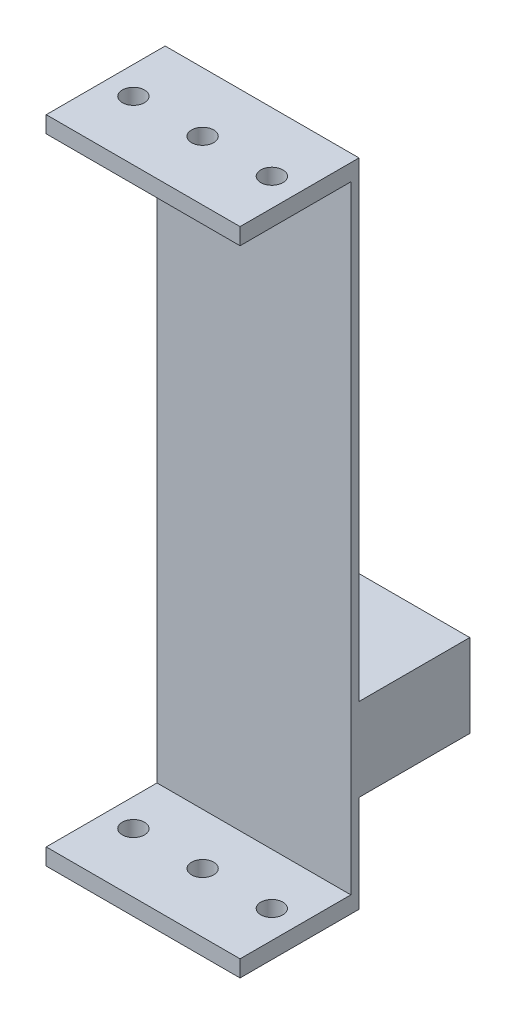
ISO-10303-21;
HEADER;
FILE_DESCRIPTION(('STEP AP214'),'2;1');
FILE_NAME('part.step','',(''),(''),'','','');
FILE_SCHEMA(('AUTOMOTIVE_DESIGN { 1 0 10303 214 1 1 1 1 }'));
ENDSEC;
DATA;
#1=APPLICATION_CONTEXT('core data for automotive mechanical design processes');
#2=APPLICATION_PROTOCOL_DEFINITION('international standard','automotive_design',2000,#1);
#3=PRODUCT_CONTEXT('',#1,'mechanical');
#4=PRODUCT('Part','Part','',(#3));
#5=PRODUCT_RELATED_PRODUCT_CATEGORY('part','',(#4));
#6=PRODUCT_DEFINITION_FORMATION('','',#4);
#7=PRODUCT_DEFINITION_CONTEXT('part definition',#1,'design');
#8=PRODUCT_DEFINITION('design','',#6,#7);
#9=PRODUCT_DEFINITION_SHAPE('','',#8);
#10=(LENGTH_UNIT() NAMED_UNIT(*) SI_UNIT(.MILLI.,.METRE.));
#11=(NAMED_UNIT(*) PLANE_ANGLE_UNIT() SI_UNIT($,.RADIAN.));
#12=(NAMED_UNIT(*) SI_UNIT($,.STERADIAN.) SOLID_ANGLE_UNIT());
#13=UNCERTAINTY_MEASURE_WITH_UNIT(LENGTH_MEASURE(1.E-05),#10,'distance_accuracy_value','');
#14=(GEOMETRIC_REPRESENTATION_CONTEXT(3) GLOBAL_UNCERTAINTY_ASSIGNED_CONTEXT((#13)) GLOBAL_UNIT_ASSIGNED_CONTEXT((#10,
#11,#12)) REPRESENTATION_CONTEXT('',''));
#15=CARTESIAN_POINT('',(0.,0.,0.));
#16=DIRECTION('',(0.,0.,1.));
#17=DIRECTION('',(1.,0.,0.));
#18=AXIS2_PLACEMENT_3D('',#15,#16,#17);
#19=CARTESIAN_POINT('',(0.,200.,2.95412979439127));
#20=DIRECTION('',(0.,0.,-1.));
#21=DIRECTION('',(-1.,0.,0.));
#22=AXIS2_PLACEMENT_3D('',#19,#20,#21);
#23=PLANE('',#22);
#24=DIRECTION('',(0.,-1.,0.));
#25=VECTOR('',#24,1.);
#26=CARTESIAN_POINT('',(70.,200.,2.95412979439127));
#27=LINE('',#26,#25);
#28=CARTESIAN_POINT('',(70.,194.,2.95412979439127));
#29=VERTEX_POINT('',#28);
#30=CARTESIAN_POINT('',(70.,-29.,2.95412979439127));
#31=VERTEX_POINT('',#30);
#32=EDGE_CURVE('E57',#29,#31,#27,.T.);
#33=ORIENTED_EDGE('',*,*,#32,.F.);
#34=DIRECTION('',(-1.,0.,0.));
#35=VECTOR('',#34,1.);
#36=CARTESIAN_POINT('',(0.,194.,2.95412979439127));
#37=LINE('',#36,#35);
#38=CARTESIAN_POINT('',(0.,194.,2.95412979439127));
#39=VERTEX_POINT('',#38);
#40=EDGE_CURVE('E164',#29,#39,#37,.T.);
#41=ORIENTED_EDGE('',*,*,#40,.T.);
#42=DIRECTION('',(0.,-1.,0.));
#43=VECTOR('',#42,1.);
#44=CARTESIAN_POINT('',(0.,200.,2.95412979439127));
#45=LINE('',#44,#43);
#46=CARTESIAN_POINT('',(0.,-29.,2.95412979439127));
#47=VERTEX_POINT('',#46);
#48=EDGE_CURVE('E148',#39,#47,#45,.T.);
#49=ORIENTED_EDGE('',*,*,#48,.T.);
#50=DIRECTION('',(-1.,0.,0.));
#51=VECTOR('',#50,1.);
#52=CARTESIAN_POINT('',(0.,-29.,2.95412979439127));
#53=LINE('',#52,#51);
#54=EDGE_CURVE('E153',#31,#47,#53,.T.);
#55=ORIENTED_EDGE('',*,*,#54,.F.);
#56=EDGE_LOOP('',(#33,#41,#49,#55));
#57=FACE_BOUND('',#56,.T.);
#58=ADVANCED_FACE('F42',(#57),#23,.F.);
#59=CARTESIAN_POINT('',(70.,30.,-40.));
#60=DIRECTION('',(0.,0.,1.));
#61=DIRECTION('',(1.,0.,0.));
#62=AXIS2_PLACEMENT_3D('',#59,#60,#61);
#63=PLANE('',#62);
#64=DIRECTION('',(-1.,0.,0.));
#65=VECTOR('',#64,1.);
#66=CARTESIAN_POINT('',(70.,0.,-40.));
#67=LINE('',#66,#65);
#68=CARTESIAN_POINT('',(70.,0.,-40.));
#69=VERTEX_POINT('',#68);
#70=CARTESIAN_POINT('',(0.,0.,-40.));
#71=VERTEX_POINT('',#70);
#72=EDGE_CURVE('E216',#69,#71,#67,.T.);
#73=ORIENTED_EDGE('',*,*,#72,.T.);
#74=DIRECTION('',(0.,-1.,0.));
#75=VECTOR('',#74,1.);
#76=CARTESIAN_POINT('',(0.,30.,-40.));
#77=LINE('',#76,#75);
#78=CARTESIAN_POINT('',(0.,30.,-40.));
#79=VERTEX_POINT('',#78);
#80=EDGE_CURVE('E11',#79,#71,#77,.T.);
#81=ORIENTED_EDGE('',*,*,#80,.F.);
#82=DIRECTION('',(-1.,0.,0.));
#83=VECTOR('',#82,1.);
#84=CARTESIAN_POINT('',(70.,30.,-40.));
#85=LINE('',#84,#83);
#86=CARTESIAN_POINT('',(70.,30.,-40.));
#87=VERTEX_POINT('',#86);
#88=EDGE_CURVE('E217',#87,#79,#85,.T.);
#89=ORIENTED_EDGE('',*,*,#88,.F.);
#90=DIRECTION('',(0.,-1.,0.));
#91=VECTOR('',#90,1.);
#92=CARTESIAN_POINT('',(70.,30.,-40.));
#93=LINE('',#92,#91);
#94=EDGE_CURVE('E50',#87,#69,#93,.T.);
#95=ORIENTED_EDGE('',*,*,#94,.T.);
#96=EDGE_LOOP('',(#73,#81,#89,#95));
#97=FACE_BOUND('',#96,.T.);
#98=ADVANCED_FACE('F44',(#97),#63,.F.);
#99=CARTESIAN_POINT('',(0.,30.,-40.));
#100=DIRECTION('',(1.,0.,0.));
#101=DIRECTION('',(0.,0.,-1.));
#102=AXIS2_PLACEMENT_3D('',#99,#100,#101);
#103=PLANE('',#102);
#104=DIRECTION('',(0.,0.,1.));
#105=VECTOR('',#104,1.);
#106=CARTESIAN_POINT('',(0.,0.,-40.));
#107=LINE('',#106,#105);
#108=CARTESIAN_POINT('',(0.,0.,0.));
#109=VERTEX_POINT('',#108);
#110=EDGE_CURVE('E225',#71,#109,#107,.T.);
#111=ORIENTED_EDGE('',*,*,#110,.T.);
#112=DIRECTION('',(0.,-1.,0.));
#113=VECTOR('',#112,1.);
#114=CARTESIAN_POINT('',(0.,200.,0.));
#115=LINE('',#114,#113);
#116=CARTESIAN_POINT('',(0.,-35.,0.));
#117=VERTEX_POINT('',#116);
#118=EDGE_CURVE('E213',#109,#117,#115,.T.);
#119=ORIENTED_EDGE('',*,*,#118,.T.);
#120=DIRECTION('',(0.,0.,1.));
#121=VECTOR('',#120,1.);
#122=CARTESIAN_POINT('',(0.,-35.,0.));
#123=LINE('',#122,#121);
#124=CARTESIAN_POINT('',(0.,-35.,42.9541297943913));
#125=VERTEX_POINT('',#124);
#126=EDGE_CURVE('E196',#117,#125,#123,.T.);
#127=ORIENTED_EDGE('',*,*,#126,.T.);
#128=DIRECTION('',(0.,-1.,0.));
#129=VECTOR('',#128,1.);
#130=CARTESIAN_POINT('',(0.,-35.,42.9541297943913));
#131=LINE('',#130,#129);
#132=CARTESIAN_POINT('',(0.,-29.,42.9541297943913));
#133=VERTEX_POINT('',#132);
#134=EDGE_CURVE('E176',#133,#125,#131,.T.);
#135=ORIENTED_EDGE('',*,*,#134,.F.);
#136=DIRECTION('',(0.,0.,-1.));
#137=VECTOR('',#136,1.);
#138=CARTESIAN_POINT('',(0.,-29.,42.9541297943913));
#139=LINE('',#138,#137);
#140=EDGE_CURVE('E186',#133,#47,#139,.T.);
#141=ORIENTED_EDGE('',*,*,#140,.T.);
#142=ORIENTED_EDGE('',*,*,#48,.F.);
#143=DIRECTION('',(0.,0.,-1.));
#144=VECTOR('',#143,1.);
#145=CARTESIAN_POINT('',(0.,194.,42.9541297943913));
#146=LINE('',#145,#144);
#147=CARTESIAN_POINT('',(0.,194.,42.9541297943913));
#148=VERTEX_POINT('',#147);
#149=EDGE_CURVE('E141',#148,#39,#146,.T.);
#150=ORIENTED_EDGE('',*,*,#149,.F.);
#151=DIRECTION('',(0.,1.,0.));
#152=VECTOR('',#151,1.);
#153=CARTESIAN_POINT('',(0.,200.,42.9541297943913));
#154=LINE('',#153,#152);
#155=CARTESIAN_POINT('',(0.,200.,42.9541297943913));
#156=VERTEX_POINT('',#155);
#157=EDGE_CURVE('E145',#148,#156,#154,.T.);
#158=ORIENTED_EDGE('',*,*,#157,.T.);
#159=DIRECTION('',(0.,0.,1.));
#160=VECTOR('',#159,1.);
#161=CARTESIAN_POINT('',(0.,200.,0.));
#162=LINE('',#161,#160);
#163=CARTESIAN_POINT('',(0.,200.,0.));
#164=VERTEX_POINT('',#163);
#165=EDGE_CURVE('E204',#164,#156,#162,.T.);
#166=ORIENTED_EDGE('',*,*,#165,.F.);
#167=CARTESIAN_POINT('',(0.,30.,0.));
#168=VERTEX_POINT('',#167);
#169=EDGE_CURVE('E214',#164,#168,#115,.T.);
#170=ORIENTED_EDGE('',*,*,#169,.T.);
#171=DIRECTION('',(0.,0.,1.));
#172=VECTOR('',#171,1.);
#173=CARTESIAN_POINT('',(0.,30.,-40.));
#174=LINE('',#173,#172);
#175=EDGE_CURVE('E86',#79,#168,#174,.T.);
#176=ORIENTED_EDGE('',*,*,#175,.F.);
#177=ORIENTED_EDGE('',*,*,#80,.T.);
#178=EDGE_LOOP('',(#111,#119,#127,#135,#141,#142,#150,#158,#166,#170,#176,#177));
#179=FACE_BOUND('',#178,.T.);
#180=ADVANCED_FACE('F144',(#179),#103,.F.);
#181=CARTESIAN_POINT('',(70.,30.,0.));
#182=DIRECTION('',(-1.,0.,0.));
#183=DIRECTION('',(0.,0.,1.));
#184=AXIS2_PLACEMENT_3D('',#181,#182,#183);
#185=PLANE('',#184);
#186=DIRECTION('',(0.,0.,-1.));
#187=VECTOR('',#186,1.);
#188=CARTESIAN_POINT('',(70.,0.,0.));
#189=LINE('',#188,#187);
#190=CARTESIAN_POINT('',(70.,0.,0.));
#191=VERTEX_POINT('',#190);
#192=EDGE_CURVE('E80',#191,#69,#189,.T.);
#193=ORIENTED_EDGE('',*,*,#192,.T.);
#194=ORIENTED_EDGE('',*,*,#94,.F.);
#195=DIRECTION('',(0.,0.,-1.));
#196=VECTOR('',#195,1.);
#197=CARTESIAN_POINT('',(70.,30.,0.));
#198=LINE('',#197,#196);
#199=CARTESIAN_POINT('',(70.,30.,0.));
#200=VERTEX_POINT('',#199);
#201=EDGE_CURVE('E66',#200,#87,#198,.T.);
#202=ORIENTED_EDGE('',*,*,#201,.F.);
#203=DIRECTION('',(0.,-1.,0.));
#204=VECTOR('',#203,1.);
#205=CARTESIAN_POINT('',(70.,200.,0.));
#206=LINE('',#205,#204);
#207=CARTESIAN_POINT('',(70.,200.,0.));
#208=VERTEX_POINT('',#207);
#209=EDGE_CURVE('E209',#208,#200,#206,.T.);
#210=ORIENTED_EDGE('',*,*,#209,.F.);
#211=DIRECTION('',(0.,0.,-1.));
#212=VECTOR('',#211,1.);
#213=CARTESIAN_POINT('',(70.,200.,2.95412979439127));
#214=LINE('',#213,#212);
#215=CARTESIAN_POINT('',(70.,200.,42.9541297943913));
#216=VERTEX_POINT('',#215);
#217=EDGE_CURVE('E206',#216,#208,#214,.T.);
#218=ORIENTED_EDGE('',*,*,#217,.F.);
#219=DIRECTION('',(0.,-1.,0.));
#220=VECTOR('',#219,1.);
#221=CARTESIAN_POINT('',(70.,194.,42.9541297943913));
#222=LINE('',#221,#220);
#223=CARTESIAN_POINT('',(70.,194.,42.9541297943913));
#224=VERTEX_POINT('',#223);
#225=EDGE_CURVE('E167',#216,#224,#222,.T.);
#226=ORIENTED_EDGE('',*,*,#225,.T.);
#227=DIRECTION('',(0.,0.,-1.));
#228=VECTOR('',#227,1.);
#229=CARTESIAN_POINT('',(70.,194.,42.9541297943913));
#230=LINE('',#229,#228);
#231=EDGE_CURVE('E154',#224,#29,#230,.T.);
#232=ORIENTED_EDGE('',*,*,#231,.T.);
#233=ORIENTED_EDGE('',*,*,#32,.T.);
#234=DIRECTION('',(0.,0.,-1.));
#235=VECTOR('',#234,1.);
#236=CARTESIAN_POINT('',(70.,-29.,42.9541297943913));
#237=LINE('',#236,#235);
#238=CARTESIAN_POINT('',(70.,-29.,42.9541297943913));
#239=VERTEX_POINT('',#238);
#240=EDGE_CURVE('E190',#239,#31,#237,.T.);
#241=ORIENTED_EDGE('',*,*,#240,.F.);
#242=DIRECTION('',(0.,1.,0.));
#243=VECTOR('',#242,1.);
#244=CARTESIAN_POINT('',(70.,-29.,42.9541297943913));
#245=LINE('',#244,#243);
#246=CARTESIAN_POINT('',(70.,-35.,42.9541297943913));
#247=VERTEX_POINT('',#246);
#248=EDGE_CURVE('E182',#247,#239,#245,.T.);
#249=ORIENTED_EDGE('',*,*,#248,.F.);
#250=DIRECTION('',(0.,0.,-1.));
#251=VECTOR('',#250,1.);
#252=CARTESIAN_POINT('',(70.,-35.,2.95412979439127));
#253=LINE('',#252,#251);
#254=CARTESIAN_POINT('',(70.,-35.,0.));
#255=VERTEX_POINT('',#254);
#256=EDGE_CURVE('E198',#247,#255,#253,.T.);
#257=ORIENTED_EDGE('',*,*,#256,.T.);
#258=EDGE_CURVE('E208',#191,#255,#206,.T.);
#259=ORIENTED_EDGE('',*,*,#258,.F.);
#260=EDGE_LOOP('',(#193,#194,#202,#210,#218,#226,#232,#233,#241,#249,#257,#259));
#261=FACE_BOUND('',#260,.T.);
#262=ADVANCED_FACE('F244',(#261),#185,.F.);
#263=CARTESIAN_POINT('',(0.,30.,0.));
#264=DIRECTION('',(0.,1.,0.));
#265=DIRECTION('',(0.,0.,1.));
#266=AXIS2_PLACEMENT_3D('',#263,#264,#265);
#267=PLANE('',#266);
#268=ORIENTED_EDGE('',*,*,#88,.T.);
#269=ORIENTED_EDGE('',*,*,#175,.T.);
#270=DIRECTION('',(1.,0.,0.));
#271=VECTOR('',#270,1.);
#272=CARTESIAN_POINT('',(0.,30.,0.));
#273=LINE('',#272,#271);
#274=EDGE_CURVE('E220',#168,#200,#273,.T.);
#275=ORIENTED_EDGE('',*,*,#274,.T.);
#276=ORIENTED_EDGE('',*,*,#201,.T.);
#277=EDGE_LOOP('',(#268,#269,#275,#276));
#278=FACE_BOUND('',#277,.T.);
#279=ADVANCED_FACE('F266',(#278),#267,.T.);
#280=CARTESIAN_POINT('',(0.,0.,0.));
#281=DIRECTION('',(0.,1.,0.));
#282=DIRECTION('',(0.,0.,1.));
#283=AXIS2_PLACEMENT_3D('',#280,#281,#282);
#284=PLANE('',#283);
#285=CARTESIAN_POINT('',(9.99999999999995,0.,-5.));
#286=DIRECTION('',(0.,-1.,0.));
#287=DIRECTION('',(0.,0.,1.));
#288=AXIS2_PLACEMENT_3D('',#285,#286,#287);
#289=CIRCLE('',#288,1.75);
#290=CARTESIAN_POINT('',(9.99999999999995,0.,-3.25));
#291=VERTEX_POINT('',#290);
#292=EDGE_CURVE('E635',#291,#291,#289,.T.);
#293=ORIENTED_EDGE('',*,*,#292,.F.);
#294=EDGE_LOOP('',(#293));
#295=FACE_BOUND('',#294,.T.);
#296=CARTESIAN_POINT('',(60.,0.,-30.));
#297=DIRECTION('',(0.,-1.,0.));
#298=DIRECTION('',(0.,0.,-1.));
#299=AXIS2_PLACEMENT_3D('',#296,#297,#298);
#300=CIRCLE('',#299,1.75);
#301=CARTESIAN_POINT('',(60.,0.,-31.75));
#302=VERTEX_POINT('',#301);
#303=EDGE_CURVE('E642',#302,#302,#300,.T.);
#304=ORIENTED_EDGE('',*,*,#303,.F.);
#305=EDGE_LOOP('',(#304));
#306=FACE_BOUND('',#305,.T.);
#307=CARTESIAN_POINT('',(9.99999999999995,0.,-30.));
#308=DIRECTION('',(0.,-1.,0.));
#309=DIRECTION('',(0.,0.,1.));
#310=AXIS2_PLACEMENT_3D('',#307,#308,#309);
#311=CIRCLE('',#310,1.75);
#312=CARTESIAN_POINT('',(9.99999999999995,0.,-28.25));
#313=VERTEX_POINT('',#312);
#314=EDGE_CURVE('E629',#313,#313,#311,.T.);
#315=ORIENTED_EDGE('',*,*,#314,.F.);
#316=EDGE_LOOP('',(#315));
#317=FACE_BOUND('',#316,.T.);
#318=CARTESIAN_POINT('',(60.,0.,-5.));
#319=DIRECTION('',(0.,-1.,0.));
#320=DIRECTION('',(0.,0.,-1.));
#321=AXIS2_PLACEMENT_3D('',#318,#319,#320);
#322=CIRCLE('',#321,1.75);
#323=CARTESIAN_POINT('',(60.,0.,-6.75));
#324=VERTEX_POINT('',#323);
#325=EDGE_CURVE('E638',#324,#324,#322,.T.);
#326=ORIENTED_EDGE('',*,*,#325,.F.);
#327=EDGE_LOOP('',(#326));
#328=FACE_BOUND('',#327,.T.);
#329=ORIENTED_EDGE('',*,*,#72,.F.);
#330=ORIENTED_EDGE('',*,*,#192,.F.);
#331=DIRECTION('',(1.,0.,0.));
#332=VECTOR('',#331,1.);
#333=CARTESIAN_POINT('',(0.,0.,0.));
#334=LINE('',#333,#332);
#335=EDGE_CURVE('E227',#109,#191,#334,.T.);
#336=ORIENTED_EDGE('',*,*,#335,.F.);
#337=ORIENTED_EDGE('',*,*,#110,.F.);
#338=EDGE_LOOP('',(#329,#330,#336,#337));
#339=FACE_BOUND('',#338,.T.);
#340=ADVANCED_FACE('F234',(#295,#306,#317,#328,#339),#284,.F.);
#341=CARTESIAN_POINT('',(70.,200.,0.));
#342=DIRECTION('',(0.,0.,1.));
#343=DIRECTION('',(1.,0.,0.));
#344=AXIS2_PLACEMENT_3D('',#341,#342,#343);
#345=PLANE('',#344);
#346=ORIENTED_EDGE('',*,*,#118,.F.);
#347=ORIENTED_EDGE('',*,*,#335,.T.);
#348=ORIENTED_EDGE('',*,*,#258,.T.);
#349=DIRECTION('',(-1.,0.,0.));
#350=VECTOR('',#349,1.);
#351=CARTESIAN_POINT('',(70.,-35.,0.));
#352=LINE('',#351,#350);
#353=EDGE_CURVE('E193',#255,#117,#352,.T.);
#354=ORIENTED_EDGE('',*,*,#353,.T.);
#355=EDGE_LOOP('',(#346,#347,#348,#354));
#356=FACE_BOUND('',#355,.T.);
#357=ADVANCED_FACE('F243',(#356),#345,.F.);
#358=ORIENTED_EDGE('',*,*,#274,.F.);
#359=ORIENTED_EDGE('',*,*,#169,.F.);
#360=DIRECTION('',(-1.,0.,0.));
#361=VECTOR('',#360,1.);
#362=CARTESIAN_POINT('',(70.,200.,0.));
#363=LINE('',#362,#361);
#364=EDGE_CURVE('E201',#208,#164,#363,.T.);
#365=ORIENTED_EDGE('',*,*,#364,.F.);
#366=ORIENTED_EDGE('',*,*,#209,.T.);
#367=EDGE_LOOP('',(#358,#359,#365,#366));
#368=FACE_BOUND('',#367,.T.);
#369=ADVANCED_FACE('F262',(#368),#345,.F.);
#370=CARTESIAN_POINT('',(0.,200.,0.));
#371=DIRECTION('',(0.,1.,0.));
#372=DIRECTION('',(0.,0.,1.));
#373=AXIS2_PLACEMENT_3D('',#370,#371,#372);
#374=PLANE('',#373);
#375=CARTESIAN_POINT('',(10.,200.,21.4770648971956));
#376=DIRECTION('',(0.,1.,0.));
#377=DIRECTION('',(0.,0.,-1.));
#378=AXIS2_PLACEMENT_3D('',#375,#376,#377);
#379=CIRCLE('',#378,4.00000000000001);
#380=CARTESIAN_POINT('',(10.,200.,17.4770648971956));
#381=VERTEX_POINT('',#380);
#382=EDGE_CURVE('E618',#381,#381,#379,.T.);
#383=ORIENTED_EDGE('',*,*,#382,.F.);
#384=EDGE_LOOP('',(#383));
#385=FACE_BOUND('',#384,.T.);
#386=CARTESIAN_POINT('',(60.,200.,21.4770648971956));
#387=DIRECTION('',(0.,1.,0.));
#388=DIRECTION('',(0.,0.,1.));
#389=AXIS2_PLACEMENT_3D('',#386,#387,#388);
#390=CIRCLE('',#389,4.00000000000001);
#391=CARTESIAN_POINT('',(60.,200.,25.4770648971956));
#392=VERTEX_POINT('',#391);
#393=EDGE_CURVE('E611',#392,#392,#390,.T.);
#394=ORIENTED_EDGE('',*,*,#393,.F.);
#395=EDGE_LOOP('',(#394));
#396=FACE_BOUND('',#395,.T.);
#397=CARTESIAN_POINT('',(35.,200.,21.4770648971956));
#398=DIRECTION('',(0.,1.,0.));
#399=DIRECTION('',(0.,0.,1.));
#400=AXIS2_PLACEMENT_3D('',#397,#398,#399);
#401=CIRCLE('',#400,4.00000000000001);
#402=CARTESIAN_POINT('',(35.,200.,25.4770648971956));
#403=VERTEX_POINT('',#402);
#404=EDGE_CURVE('E614',#403,#403,#401,.T.);
#405=ORIENTED_EDGE('',*,*,#404,.F.);
#406=EDGE_LOOP('',(#405));
#407=FACE_BOUND('',#406,.T.);
#408=ORIENTED_EDGE('',*,*,#364,.T.);
#409=ORIENTED_EDGE('',*,*,#165,.T.);
#410=DIRECTION('',(1.,0.,0.));
#411=VECTOR('',#410,1.);
#412=CARTESIAN_POINT('',(70.,200.,42.9541297943913));
#413=LINE('',#412,#411);
#414=EDGE_CURVE('E163',#156,#216,#413,.T.);
#415=ORIENTED_EDGE('',*,*,#414,.T.);
#416=ORIENTED_EDGE('',*,*,#217,.T.);
#417=EDGE_LOOP('',(#408,#409,#415,#416));
#418=FACE_BOUND('',#417,.T.);
#419=ADVANCED_FACE('F260',(#385,#396,#407,#418),#374,.T.);
#420=CARTESIAN_POINT('',(0.,-35.,0.));
#421=DIRECTION('',(0.,1.,0.));
#422=DIRECTION('',(0.,0.,1.));
#423=AXIS2_PLACEMENT_3D('',#420,#421,#422);
#424=PLANE('',#423);
#425=CARTESIAN_POINT('',(10.,-35.,21.4770648971956));
#426=DIRECTION('',(0.,1.,0.));
#427=DIRECTION('',(0.,0.,-1.));
#428=AXIS2_PLACEMENT_3D('',#425,#426,#427);
#429=CIRCLE('',#428,4.00000000000001);
#430=CARTESIAN_POINT('',(10.,-35.,17.4770648971956));
#431=VERTEX_POINT('',#430);
#432=EDGE_CURVE('E597',#431,#431,#429,.T.);
#433=ORIENTED_EDGE('',*,*,#432,.T.);
#434=EDGE_LOOP('',(#433));
#435=FACE_BOUND('',#434,.T.);
#436=CARTESIAN_POINT('',(60.,-35.,21.4770648971956));
#437=DIRECTION('',(0.,1.,0.));
#438=DIRECTION('',(0.,0.,1.));
#439=AXIS2_PLACEMENT_3D('',#436,#437,#438);
#440=CIRCLE('',#439,4.00000000000001);
#441=CARTESIAN_POINT('',(60.,-35.,25.4770648971956));
#442=VERTEX_POINT('',#441);
#443=EDGE_CURVE('E599',#442,#442,#440,.T.);
#444=ORIENTED_EDGE('',*,*,#443,.T.);
#445=EDGE_LOOP('',(#444));
#446=FACE_BOUND('',#445,.T.);
#447=CARTESIAN_POINT('',(35.,-35.,21.4770648971956));
#448=DIRECTION('',(0.,1.,0.));
#449=DIRECTION('',(0.,0.,1.));
#450=AXIS2_PLACEMENT_3D('',#447,#448,#449);
#451=CIRCLE('',#450,4.00000000000001);
#452=CARTESIAN_POINT('',(35.,-35.,25.4770648971956));
#453=VERTEX_POINT('',#452);
#454=EDGE_CURVE('E607',#453,#453,#451,.T.);
#455=ORIENTED_EDGE('',*,*,#454,.T.);
#456=EDGE_LOOP('',(#455));
#457=FACE_BOUND('',#456,.T.);
#458=ORIENTED_EDGE('',*,*,#353,.F.);
#459=ORIENTED_EDGE('',*,*,#256,.F.);
#460=DIRECTION('',(1.,0.,0.));
#461=VECTOR('',#460,1.);
#462=CARTESIAN_POINT('',(70.,-35.,42.9541297943913));
#463=LINE('',#462,#461);
#464=EDGE_CURVE('E179',#125,#247,#463,.T.);
#465=ORIENTED_EDGE('',*,*,#464,.F.);
#466=ORIENTED_EDGE('',*,*,#126,.F.);
#467=EDGE_LOOP('',(#458,#459,#465,#466));
#468=FACE_BOUND('',#467,.T.);
#469=ADVANCED_FACE('F242',(#435,#446,#457,#468),#424,.F.);
#470=CARTESIAN_POINT('',(0.,-29.,42.9541297943913));
#471=DIRECTION('',(0.,-1.,0.));
#472=DIRECTION('',(1.,0.,0.));
#473=AXIS2_PLACEMENT_3D('',#470,#471,#472);
#474=PLANE('',#473);
#475=CARTESIAN_POINT('',(10.,-29.,21.4770648971956));
#476=DIRECTION('',(0.,1.,0.));
#477=DIRECTION('',(0.,0.,-1.));
#478=AXIS2_PLACEMENT_3D('',#475,#476,#477);
#479=CIRCLE('',#478,4.00000000000001);
#480=CARTESIAN_POINT('',(10.,-29.,17.4770648971956));
#481=VERTEX_POINT('',#480);
#482=EDGE_CURVE('E594',#481,#481,#479,.T.);
#483=ORIENTED_EDGE('',*,*,#482,.F.);
#484=EDGE_LOOP('',(#483));
#485=FACE_BOUND('',#484,.T.);
#486=CARTESIAN_POINT('',(60.,-29.,21.4770648971956));
#487=DIRECTION('',(0.,1.,0.));
#488=DIRECTION('',(0.,0.,1.));
#489=AXIS2_PLACEMENT_3D('',#486,#487,#488);
#490=CIRCLE('',#489,4.00000000000001);
#491=CARTESIAN_POINT('',(60.,-29.,25.4770648971956));
#492=VERTEX_POINT('',#491);
#493=EDGE_CURVE('E610',#492,#492,#490,.T.);
#494=ORIENTED_EDGE('',*,*,#493,.F.);
#495=EDGE_LOOP('',(#494));
#496=FACE_BOUND('',#495,.T.);
#497=CARTESIAN_POINT('',(35.,-29.,21.4770648971956));
#498=DIRECTION('',(0.,1.,0.));
#499=DIRECTION('',(0.,0.,1.));
#500=AXIS2_PLACEMENT_3D('',#497,#498,#499);
#501=CIRCLE('',#500,4.00000000000001);
#502=CARTESIAN_POINT('',(35.,-29.,25.4770648971956));
#503=VERTEX_POINT('',#502);
#504=EDGE_CURVE('E603',#503,#503,#501,.T.);
#505=ORIENTED_EDGE('',*,*,#504,.F.);
#506=EDGE_LOOP('',(#505));
#507=FACE_BOUND('',#506,.T.);
#508=ORIENTED_EDGE('',*,*,#54,.T.);
#509=ORIENTED_EDGE('',*,*,#140,.F.);
#510=DIRECTION('',(-1.,0.,0.));
#511=VECTOR('',#510,1.);
#512=CARTESIAN_POINT('',(0.,-29.,42.9541297943913));
#513=LINE('',#512,#511);
#514=EDGE_CURVE('E184',#239,#133,#513,.T.);
#515=ORIENTED_EDGE('',*,*,#514,.F.);
#516=ORIENTED_EDGE('',*,*,#240,.T.);
#517=EDGE_LOOP('',(#508,#509,#515,#516));
#518=FACE_BOUND('',#517,.T.);
#519=ADVANCED_FACE('F251',(#485,#496,#507,#518),#474,.F.);
#520=CARTESIAN_POINT('',(0.,0.,42.9541297943913));
#521=DIRECTION('',(0.,0.,-1.));
#522=DIRECTION('',(-1.,0.,0.));
#523=AXIS2_PLACEMENT_3D('',#520,#521,#522);
#524=PLANE('',#523);
#525=ORIENTED_EDGE('',*,*,#134,.T.);
#526=ORIENTED_EDGE('',*,*,#464,.T.);
#527=ORIENTED_EDGE('',*,*,#248,.T.);
#528=ORIENTED_EDGE('',*,*,#514,.T.);
#529=EDGE_LOOP('',(#525,#526,#527,#528));
#530=FACE_BOUND('',#529,.T.);
#531=ADVANCED_FACE('F247',(#530),#524,.F.);
#532=CARTESIAN_POINT('',(0.,194.,42.9541297943913));
#533=DIRECTION('',(0.,-1.,0.));
#534=DIRECTION('',(1.,0.,0.));
#535=AXIS2_PLACEMENT_3D('',#532,#533,#534);
#536=PLANE('',#535);
#537=CARTESIAN_POINT('',(10.,194.,21.4770648971956));
#538=DIRECTION('',(0.,1.,0.));
#539=DIRECTION('',(0.,0.,-1.));
#540=AXIS2_PLACEMENT_3D('',#537,#538,#539);
#541=CIRCLE('',#540,4.00000000000001);
#542=CARTESIAN_POINT('',(10.,194.,17.4770648971956));
#543=VERTEX_POINT('',#542);
#544=EDGE_CURVE('E606',#543,#543,#541,.T.);
#545=ORIENTED_EDGE('',*,*,#544,.T.);
#546=EDGE_LOOP('',(#545));
#547=FACE_BOUND('',#546,.T.);
#548=CARTESIAN_POINT('',(60.,194.,21.4770648971956));
#549=DIRECTION('',(0.,1.,0.));
#550=DIRECTION('',(0.,0.,1.));
#551=AXIS2_PLACEMENT_3D('',#548,#549,#550);
#552=CIRCLE('',#551,4.00000000000001);
#553=CARTESIAN_POINT('',(60.,194.,25.4770648971956));
#554=VERTEX_POINT('',#553);
#555=EDGE_CURVE('E615',#554,#554,#552,.T.);
#556=ORIENTED_EDGE('',*,*,#555,.T.);
#557=EDGE_LOOP('',(#556));
#558=FACE_BOUND('',#557,.T.);
#559=CARTESIAN_POINT('',(35.,194.,21.4770648971956));
#560=DIRECTION('',(0.,1.,0.));
#561=DIRECTION('',(0.,0.,1.));
#562=AXIS2_PLACEMENT_3D('',#559,#560,#561);
#563=CIRCLE('',#562,4.00000000000001);
#564=CARTESIAN_POINT('',(35.,194.,25.4770648971956));
#565=VERTEX_POINT('',#564);
#566=EDGE_CURVE('E623',#565,#565,#563,.T.);
#567=ORIENTED_EDGE('',*,*,#566,.T.);
#568=EDGE_LOOP('',(#567));
#569=FACE_BOUND('',#568,.T.);
#570=ORIENTED_EDGE('',*,*,#40,.F.);
#571=ORIENTED_EDGE('',*,*,#231,.F.);
#572=DIRECTION('',(-1.,0.,0.));
#573=VECTOR('',#572,1.);
#574=CARTESIAN_POINT('',(0.,194.,42.9541297943913));
#575=LINE('',#574,#573);
#576=EDGE_CURVE('E160',#224,#148,#575,.T.);
#577=ORIENTED_EDGE('',*,*,#576,.T.);
#578=ORIENTED_EDGE('',*,*,#149,.T.);
#579=EDGE_LOOP('',(#570,#571,#577,#578));
#580=FACE_BOUND('',#579,.T.);
#581=ADVANCED_FACE('F166',(#547,#558,#569,#580),#536,.T.);
#582=CARTESIAN_POINT('',(0.,165.,42.9541297943913));
#583=DIRECTION('',(0.,0.,-1.));
#584=DIRECTION('',(-1.,0.,0.));
#585=AXIS2_PLACEMENT_3D('',#582,#583,#584);
#586=PLANE('',#585);
#587=ORIENTED_EDGE('',*,*,#157,.F.);
#588=ORIENTED_EDGE('',*,*,#576,.F.);
#589=ORIENTED_EDGE('',*,*,#225,.F.);
#590=ORIENTED_EDGE('',*,*,#414,.F.);
#591=EDGE_LOOP('',(#587,#588,#589,#590));
#592=FACE_BOUND('',#591,.T.);
#593=ADVANCED_FACE('F158',(#592),#586,.F.);
#594=CARTESIAN_POINT('',(60.,6.,-5.));
#595=DIRECTION('',(0.,-1.,0.));
#596=DIRECTION('',(0.,0.,-1.));
#597=AXIS2_PLACEMENT_3D('',#594,#595,#596);
#598=CYLINDRICAL_SURFACE('',#597,1.75);
#599=CARTESIAN_POINT('',(60.,6.,-5.));
#600=DIRECTION('',(0.,-1.,0.));
#601=DIRECTION('',(0.,0.,-1.));
#602=AXIS2_PLACEMENT_3D('',#599,#600,#601);
#603=CIRCLE('',#602,1.75);
#604=CARTESIAN_POINT('',(60.,6.,-6.75));
#605=VERTEX_POINT('',#604);
#606=EDGE_CURVE('E174',#605,#605,#603,.T.);
#607=ORIENTED_EDGE('',*,*,#606,.F.);
#608=EDGE_LOOP('',(#607));
#609=FACE_BOUND('',#608,.T.);
#610=ORIENTED_EDGE('',*,*,#325,.T.);
#611=EDGE_LOOP('',(#610));
#612=FACE_BOUND('',#611,.T.);
#613=ADVANCED_FACE('F342',(#609,#612),#598,.F.);
#614=CARTESIAN_POINT('',(60.,6.,-5.));
#615=DIRECTION('',(0.,-1.,0.));
#616=DIRECTION('',(0.,0.,-1.));
#617=AXIS2_PLACEMENT_3D('',#614,#615,#616);
#618=PLANE('',#617);
#619=ORIENTED_EDGE('',*,*,#606,.T.);
#620=EDGE_LOOP('',(#619));
#621=FACE_BOUND('',#620,.T.);
#622=ADVANCED_FACE('F348',(#621),#618,.T.);
#623=CARTESIAN_POINT('',(9.99999999999995,6.,-30.));
#624=DIRECTION('',(0.,-1.,0.));
#625=DIRECTION('',(0.,0.,-1.));
#626=AXIS2_PLACEMENT_3D('',#623,#624,#625);
#627=CYLINDRICAL_SURFACE('',#626,1.75);
#628=CARTESIAN_POINT('',(9.99999999999995,6.,-30.));
#629=DIRECTION('',(0.,-1.,0.));
#630=DIRECTION('',(0.,0.,1.));
#631=AXIS2_PLACEMENT_3D('',#628,#629,#630);
#632=CIRCLE('',#631,1.75);
#633=CARTESIAN_POINT('',(9.99999999999995,6.,-28.25));
#634=VERTEX_POINT('',#633);
#635=EDGE_CURVE('E626',#634,#634,#632,.T.);
#636=ORIENTED_EDGE('',*,*,#635,.F.);
#637=EDGE_LOOP('',(#636));
#638=FACE_BOUND('',#637,.T.);
#639=ORIENTED_EDGE('',*,*,#314,.T.);
#640=EDGE_LOOP('',(#639));
#641=FACE_BOUND('',#640,.T.);
#642=ADVANCED_FACE('F356',(#638,#641),#627,.F.);
#643=CARTESIAN_POINT('',(9.99999999999995,6.,-30.));
#644=DIRECTION('',(0.,1.,0.));
#645=DIRECTION('',(0.,0.,1.));
#646=AXIS2_PLACEMENT_3D('',#643,#644,#645);
#647=PLANE('',#646);
#648=ORIENTED_EDGE('',*,*,#635,.T.);
#649=EDGE_LOOP('',(#648));
#650=FACE_BOUND('',#649,.T.);
#651=ADVANCED_FACE('F364',(#650),#647,.F.);
#652=CARTESIAN_POINT('',(60.,6.,-30.));
#653=DIRECTION('',(0.,-1.,0.));
#654=DIRECTION('',(0.,0.,-1.));
#655=AXIS2_PLACEMENT_3D('',#652,#653,#654);
#656=CYLINDRICAL_SURFACE('',#655,1.75);
#657=CARTESIAN_POINT('',(60.,6.,-30.));
#658=DIRECTION('',(0.,-1.,0.));
#659=DIRECTION('',(0.,0.,-1.));
#660=AXIS2_PLACEMENT_3D('',#657,#658,#659);
#661=CIRCLE('',#660,1.75);
#662=CARTESIAN_POINT('',(60.,6.,-31.75));
#663=VERTEX_POINT('',#662);
#664=EDGE_CURVE('E632',#663,#663,#661,.T.);
#665=ORIENTED_EDGE('',*,*,#664,.F.);
#666=EDGE_LOOP('',(#665));
#667=FACE_BOUND('',#666,.T.);
#668=ORIENTED_EDGE('',*,*,#303,.T.);
#669=EDGE_LOOP('',(#668));
#670=FACE_BOUND('',#669,.T.);
#671=ADVANCED_FACE('F372',(#667,#670),#656,.F.);
#672=CARTESIAN_POINT('',(60.,6.,-30.));
#673=DIRECTION('',(0.,-1.,0.));
#674=DIRECTION('',(0.,0.,-1.));
#675=AXIS2_PLACEMENT_3D('',#672,#673,#674);
#676=PLANE('',#675);
#677=ORIENTED_EDGE('',*,*,#664,.T.);
#678=EDGE_LOOP('',(#677));
#679=FACE_BOUND('',#678,.T.);
#680=ADVANCED_FACE('F380',(#679),#676,.T.);
#681=CARTESIAN_POINT('',(9.99999999999995,6.,-5.));
#682=DIRECTION('',(0.,-1.,0.));
#683=DIRECTION('',(0.,0.,-1.));
#684=AXIS2_PLACEMENT_3D('',#681,#682,#683);
#685=CYLINDRICAL_SURFACE('',#684,1.75);
#686=CARTESIAN_POINT('',(9.99999999999995,6.,-5.));
#687=DIRECTION('',(0.,-1.,0.));
#688=DIRECTION('',(0.,0.,1.));
#689=AXIS2_PLACEMENT_3D('',#686,#687,#688);
#690=CIRCLE('',#689,1.75);
#691=CARTESIAN_POINT('',(9.99999999999995,6.,-3.25));
#692=VERTEX_POINT('',#691);
#693=EDGE_CURVE('E639',#692,#692,#690,.T.);
#694=ORIENTED_EDGE('',*,*,#693,.F.);
#695=EDGE_LOOP('',(#694));
#696=FACE_BOUND('',#695,.T.);
#697=ORIENTED_EDGE('',*,*,#292,.T.);
#698=EDGE_LOOP('',(#697));
#699=FACE_BOUND('',#698,.T.);
#700=ADVANCED_FACE('F388',(#696,#699),#685,.F.);
#701=CARTESIAN_POINT('',(9.99999999999995,6.,-5.));
#702=DIRECTION('',(0.,1.,0.));
#703=DIRECTION('',(0.,0.,1.));
#704=AXIS2_PLACEMENT_3D('',#701,#702,#703);
#705=PLANE('',#704);
#706=ORIENTED_EDGE('',*,*,#693,.T.);
#707=EDGE_LOOP('',(#706));
#708=FACE_BOUND('',#707,.T.);
#709=ADVANCED_FACE('F396',(#708),#705,.F.);
#710=CARTESIAN_POINT('',(35.,194.,21.4770648971956));
#711=DIRECTION('',(0.,1.,0.));
#712=DIRECTION('',(0.,0.,1.));
#713=AXIS2_PLACEMENT_3D('',#710,#711,#712);
#714=CYLINDRICAL_SURFACE('',#713,4.00000000000001);
#715=ORIENTED_EDGE('',*,*,#566,.F.);
#716=EDGE_LOOP('',(#715));
#717=FACE_BOUND('',#716,.T.);
#718=ORIENTED_EDGE('',*,*,#404,.T.);
#719=EDGE_LOOP('',(#718));
#720=FACE_BOUND('',#719,.T.);
#721=ADVANCED_FACE('F403',(#717,#720),#714,.F.);
#722=CARTESIAN_POINT('',(60.,194.,21.4770648971956));
#723=DIRECTION('',(0.,1.,0.));
#724=DIRECTION('',(0.,0.,1.));
#725=AXIS2_PLACEMENT_3D('',#722,#723,#724);
#726=CYLINDRICAL_SURFACE('',#725,4.00000000000001);
#727=ORIENTED_EDGE('',*,*,#555,.F.);
#728=EDGE_LOOP('',(#727));
#729=FACE_BOUND('',#728,.T.);
#730=ORIENTED_EDGE('',*,*,#393,.T.);
#731=EDGE_LOOP('',(#730));
#732=FACE_BOUND('',#731,.T.);
#733=ADVANCED_FACE('F410',(#729,#732),#726,.F.);
#734=CARTESIAN_POINT('',(10.,194.,21.4770648971956));
#735=DIRECTION('',(0.,1.,0.));
#736=DIRECTION('',(0.,0.,1.));
#737=AXIS2_PLACEMENT_3D('',#734,#735,#736);
#738=CYLINDRICAL_SURFACE('',#737,4.00000000000001);
#739=ORIENTED_EDGE('',*,*,#544,.F.);
#740=EDGE_LOOP('',(#739));
#741=FACE_BOUND('',#740,.T.);
#742=ORIENTED_EDGE('',*,*,#382,.T.);
#743=EDGE_LOOP('',(#742));
#744=FACE_BOUND('',#743,.T.);
#745=ADVANCED_FACE('F418',(#741,#744),#738,.F.);
#746=CARTESIAN_POINT('',(35.,-29.,21.4770648971956));
#747=DIRECTION('',(0.,-1.,0.));
#748=DIRECTION('',(0.,0.,-1.));
#749=AXIS2_PLACEMENT_3D('',#746,#747,#748);
#750=CYLINDRICAL_SURFACE('',#749,4.00000000000001);
#751=ORIENTED_EDGE('',*,*,#504,.T.);
#752=EDGE_LOOP('',(#751));
#753=FACE_BOUND('',#752,.T.);
#754=ORIENTED_EDGE('',*,*,#454,.F.);
#755=EDGE_LOOP('',(#754));
#756=FACE_BOUND('',#755,.T.);
#757=ADVANCED_FACE('F425',(#753,#756),#750,.F.);
#758=CARTESIAN_POINT('',(60.,-29.,21.4770648971956));
#759=DIRECTION('',(0.,-1.,0.));
#760=DIRECTION('',(0.,0.,-1.));
#761=AXIS2_PLACEMENT_3D('',#758,#759,#760);
#762=CYLINDRICAL_SURFACE('',#761,4.00000000000001);
#763=ORIENTED_EDGE('',*,*,#493,.T.);
#764=EDGE_LOOP('',(#763));
#765=FACE_BOUND('',#764,.T.);
#766=ORIENTED_EDGE('',*,*,#443,.F.);
#767=EDGE_LOOP('',(#766));
#768=FACE_BOUND('',#767,.T.);
#769=ADVANCED_FACE('F432',(#765,#768),#762,.F.);
#770=CARTESIAN_POINT('',(10.,-29.,21.4770648971956));
#771=DIRECTION('',(0.,-1.,0.));
#772=DIRECTION('',(0.,0.,-1.));
#773=AXIS2_PLACEMENT_3D('',#770,#771,#772);
#774=CYLINDRICAL_SURFACE('',#773,4.00000000000001);
#775=ORIENTED_EDGE('',*,*,#482,.T.);
#776=EDGE_LOOP('',(#775));
#777=FACE_BOUND('',#776,.T.);
#778=ORIENTED_EDGE('',*,*,#432,.F.);
#779=EDGE_LOOP('',(#778));
#780=FACE_BOUND('',#779,.T.);
#781=ADVANCED_FACE('F440',(#777,#780),#774,.F.);
#782=CLOSED_SHELL('',(#58,#98,#180,#262,#279,#340,#357,#369,#419,#469,#519,#531,#581,#593,#613,
#622,#642,#651,#671,#680,#700,#709,#721,#733,#745,#757,#769,#781));
#783=MANIFOLD_SOLID_BREP('B2',#782);
#784=ADVANCED_BREP_SHAPE_REPRESENTATION('',(#18,#783),#14);
#785=SHAPE_DEFINITION_REPRESENTATION(#9,#784);
ENDSEC;
END-ISO-10303-21;
